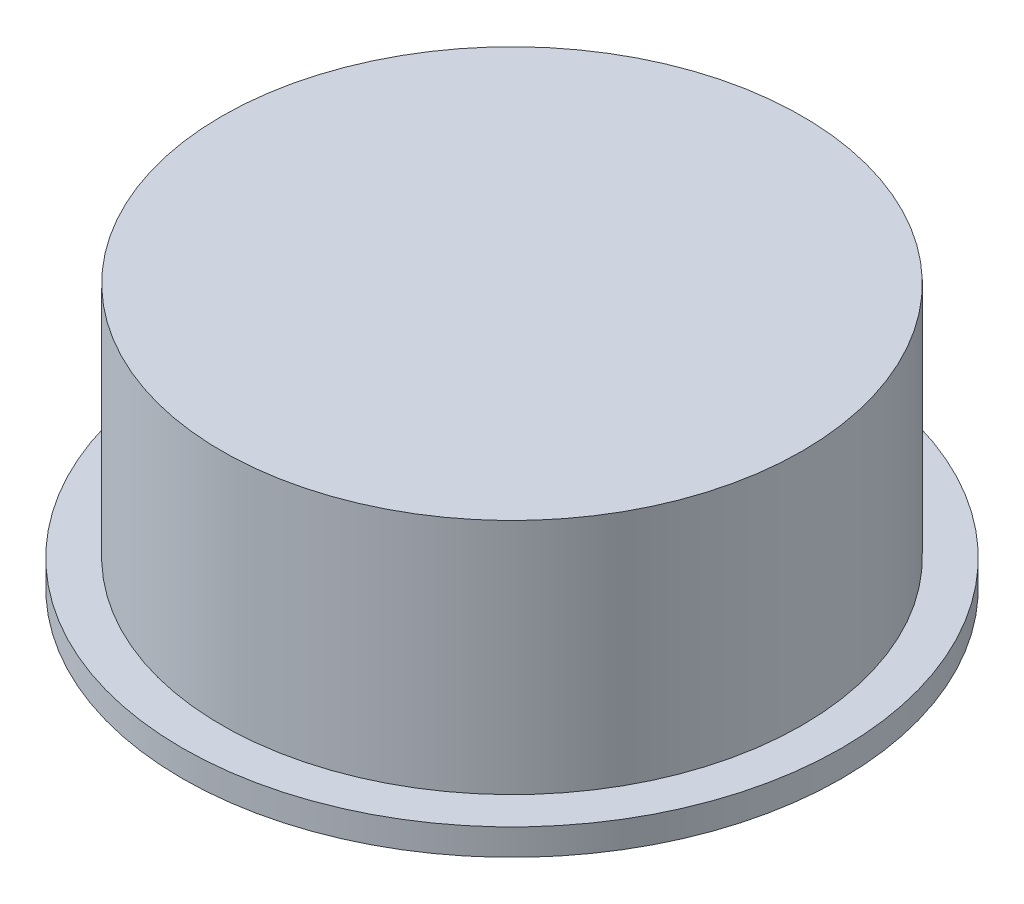
ISO-10303-21;
HEADER;
FILE_DESCRIPTION(('STEP AP214'),'2;1');
FILE_NAME('part.step','',(''),(''),'','','');
FILE_SCHEMA(('AUTOMOTIVE_DESIGN { 1 0 10303 214 1 1 1 1 }'));
ENDSEC;
DATA;
#1=APPLICATION_CONTEXT('core data for automotive mechanical design processes');
#2=APPLICATION_PROTOCOL_DEFINITION('international standard','automotive_design',2000,#1);
#3=PRODUCT_CONTEXT('',#1,'mechanical');
#4=PRODUCT('Part','Part','',(#3));
#5=PRODUCT_RELATED_PRODUCT_CATEGORY('part','',(#4));
#6=PRODUCT_DEFINITION_FORMATION('','',#4);
#7=PRODUCT_DEFINITION_CONTEXT('part definition',#1,'design');
#8=PRODUCT_DEFINITION('design','',#6,#7);
#9=PRODUCT_DEFINITION_SHAPE('','',#8);
#10=(LENGTH_UNIT() NAMED_UNIT(*) SI_UNIT(.MILLI.,.METRE.));
#11=(NAMED_UNIT(*) PLANE_ANGLE_UNIT() SI_UNIT($,.RADIAN.));
#12=(NAMED_UNIT(*) SI_UNIT($,.STERADIAN.) SOLID_ANGLE_UNIT());
#13=UNCERTAINTY_MEASURE_WITH_UNIT(LENGTH_MEASURE(1.E-05),#10,'distance_accuracy_value','');
#14=(GEOMETRIC_REPRESENTATION_CONTEXT(3) GLOBAL_UNCERTAINTY_ASSIGNED_CONTEXT((#13)) GLOBAL_UNIT_ASSIGNED_CONTEXT((#10,
#11,#12)) REPRESENTATION_CONTEXT('',''));
#15=CARTESIAN_POINT('',(0.,0.,0.));
#16=DIRECTION('',(0.,0.,1.));
#17=DIRECTION('',(1.,0.,0.));
#18=AXIS2_PLACEMENT_3D('',#15,#16,#17);
#19=CARTESIAN_POINT('',(0.,18.1891600450789,0.));
#20=DIRECTION('',(0.,1.,0.));
#21=DIRECTION('',(-1.,0.,0.));
#22=AXIS2_PLACEMENT_3D('',#19,#20,#21);
#23=CYLINDRICAL_SURFACE('',#22,30.);
#24=CARTESIAN_POINT('',(0.,27.,0.));
#25=DIRECTION('',(0.,1.,0.));
#26=DIRECTION('',(-1.,0.,0.));
#27=AXIS2_PLACEMENT_3D('',#24,#25,#26);
#28=CIRCLE('',#27,30.);
#29=CARTESIAN_POINT('',(-30.,27.,0.));
#30=VERTEX_POINT('',#29);
#31=EDGE_CURVE('E57',#30,#30,#28,.T.);
#32=ORIENTED_EDGE('',*,*,#31,.T.);
#33=EDGE_LOOP('',(#32));
#34=FACE_BOUND('',#33,.T.);
#35=CARTESIAN_POINT('',(0.,0.,0.));
#36=DIRECTION('',(0.,1.,0.));
#37=DIRECTION('',(-1.,0.,0.));
#38=AXIS2_PLACEMENT_3D('',#35,#36,#37);
#39=CIRCLE('',#38,30.);
#40=CARTESIAN_POINT('',(-30.,0.,0.));
#41=VERTEX_POINT('',#40);
#42=EDGE_CURVE('E10',#41,#41,#39,.T.);
#43=ORIENTED_EDGE('',*,*,#42,.F.);
#44=EDGE_LOOP('',(#43));
#45=FACE_BOUND('',#44,.T.);
#46=ADVANCED_FACE('F35',(#34,#45),#23,.F.);
#47=CARTESIAN_POINT('',(-37.5,0.,0.));
#48=DIRECTION('',(0.,-1.,0.));
#49=DIRECTION('',(1.,0.,0.));
#50=AXIS2_PLACEMENT_3D('',#47,#48,#49);
#51=PLANE('',#50);
#52=ORIENTED_EDGE('',*,*,#42,.T.);
#53=EDGE_LOOP('',(#52));
#54=FACE_BOUND('',#53,.T.);
#55=CARTESIAN_POINT('',(0.,0.,0.));
#56=DIRECTION('',(0.,1.,0.));
#57=DIRECTION('',(-1.,0.,0.));
#58=AXIS2_PLACEMENT_3D('',#55,#56,#57);
#59=CIRCLE('',#58,37.5);
#60=CARTESIAN_POINT('',(-37.5,0.,0.));
#61=VERTEX_POINT('',#60);
#62=EDGE_CURVE('E41',#61,#61,#59,.T.);
#63=ORIENTED_EDGE('',*,*,#62,.F.);
#64=EDGE_LOOP('',(#63));
#65=FACE_BOUND('',#64,.T.);
#66=ADVANCED_FACE('F74',(#54,#65),#51,.T.);
#67=CARTESIAN_POINT('',(0.,18.1891600450789,0.));
#68=DIRECTION('',(0.,1.,0.));
#69=DIRECTION('',(-1.,0.,0.));
#70=AXIS2_PLACEMENT_3D('',#67,#68,#69);
#71=CYLINDRICAL_SURFACE('',#70,37.5);
#72=ORIENTED_EDGE('',*,*,#62,.T.);
#73=EDGE_LOOP('',(#72));
#74=FACE_BOUND('',#73,.T.);
#75=CARTESIAN_POINT('',(0.,3.00000000000001,0.));
#76=DIRECTION('',(0.,1.,0.));
#77=DIRECTION('',(-1.,0.,0.));
#78=AXIS2_PLACEMENT_3D('',#75,#76,#77);
#79=CIRCLE('',#78,37.5);
#80=CARTESIAN_POINT('',(-37.5,3.,0.));
#81=VERTEX_POINT('',#80);
#82=EDGE_CURVE('E45',#81,#81,#79,.T.);
#83=ORIENTED_EDGE('',*,*,#82,.F.);
#84=EDGE_LOOP('',(#83));
#85=FACE_BOUND('',#84,.T.);
#86=ADVANCED_FACE('F78',(#74,#85),#71,.T.);
#87=CARTESIAN_POINT('',(-33.,3.,0.));
#88=DIRECTION('',(0.,1.,0.));
#89=DIRECTION('',(-1.,0.,0.));
#90=AXIS2_PLACEMENT_3D('',#87,#88,#89);
#91=PLANE('',#90);
#92=ORIENTED_EDGE('',*,*,#82,.T.);
#93=EDGE_LOOP('',(#92));
#94=FACE_BOUND('',#93,.T.);
#95=CARTESIAN_POINT('',(0.,3.,0.));
#96=DIRECTION('',(0.,1.,0.));
#97=DIRECTION('',(-1.,0.,0.));
#98=AXIS2_PLACEMENT_3D('',#95,#96,#97);
#99=CIRCLE('',#98,33.);
#100=CARTESIAN_POINT('',(-33.,3.,0.));
#101=VERTEX_POINT('',#100);
#102=EDGE_CURVE('E49',#101,#101,#99,.T.);
#103=ORIENTED_EDGE('',*,*,#102,.F.);
#104=EDGE_LOOP('',(#103));
#105=FACE_BOUND('',#104,.T.);
#106=ADVANCED_FACE('F82',(#94,#105),#91,.T.);
#107=CARTESIAN_POINT('',(0.,18.1891600450789,0.));
#108=DIRECTION('',(0.,1.,0.));
#109=DIRECTION('',(-1.,0.,0.));
#110=AXIS2_PLACEMENT_3D('',#107,#108,#109);
#111=CYLINDRICAL_SURFACE('',#110,33.);
#112=ORIENTED_EDGE('',*,*,#102,.T.);
#113=EDGE_LOOP('',(#112));
#114=FACE_BOUND('',#113,.T.);
#115=CARTESIAN_POINT('',(0.,30.,0.));
#116=DIRECTION('',(0.,1.,0.));
#117=DIRECTION('',(-1.,0.,0.));
#118=AXIS2_PLACEMENT_3D('',#115,#116,#117);
#119=CIRCLE('',#118,33.);
#120=CARTESIAN_POINT('',(-33.,30.,0.));
#121=VERTEX_POINT('',#120);
#122=EDGE_CURVE('E54',#121,#121,#119,.T.);
#123=ORIENTED_EDGE('',*,*,#122,.F.);
#124=EDGE_LOOP('',(#123));
#125=FACE_BOUND('',#124,.T.);
#126=ADVANCED_FACE('F70',(#114,#125),#111,.T.);
#127=CARTESIAN_POINT('',(0.,30.,0.));
#128=DIRECTION('',(0.,1.,0.));
#129=DIRECTION('',(-1.,0.,0.));
#130=AXIS2_PLACEMENT_3D('',#127,#128,#129);
#131=PLANE('',#130);
#132=ORIENTED_EDGE('',*,*,#122,.T.);
#133=EDGE_LOOP('',(#132));
#134=FACE_BOUND('',#133,.T.);
#135=ADVANCED_FACE('F65',(#134),#131,.T.);
#136=CARTESIAN_POINT('',(-30.,27.,0.));
#137=DIRECTION('',(0.,-1.,0.));
#138=DIRECTION('',(1.,0.,0.));
#139=AXIS2_PLACEMENT_3D('',#136,#137,#138);
#140=PLANE('',#139);
#141=ORIENTED_EDGE('',*,*,#31,.F.);
#142=EDGE_LOOP('',(#141));
#143=FACE_BOUND('',#142,.T.);
#144=ADVANCED_FACE('F63',(#143),#140,.T.);
#145=CLOSED_SHELL('',(#46,#66,#86,#106,#126,#135,#144));
#146=MANIFOLD_SOLID_BREP('B2',#145);
#147=ADVANCED_BREP_SHAPE_REPRESENTATION('',(#18,#146),#14);
#148=SHAPE_DEFINITION_REPRESENTATION(#9,#147);
ENDSEC;
END-ISO-10303-21;
